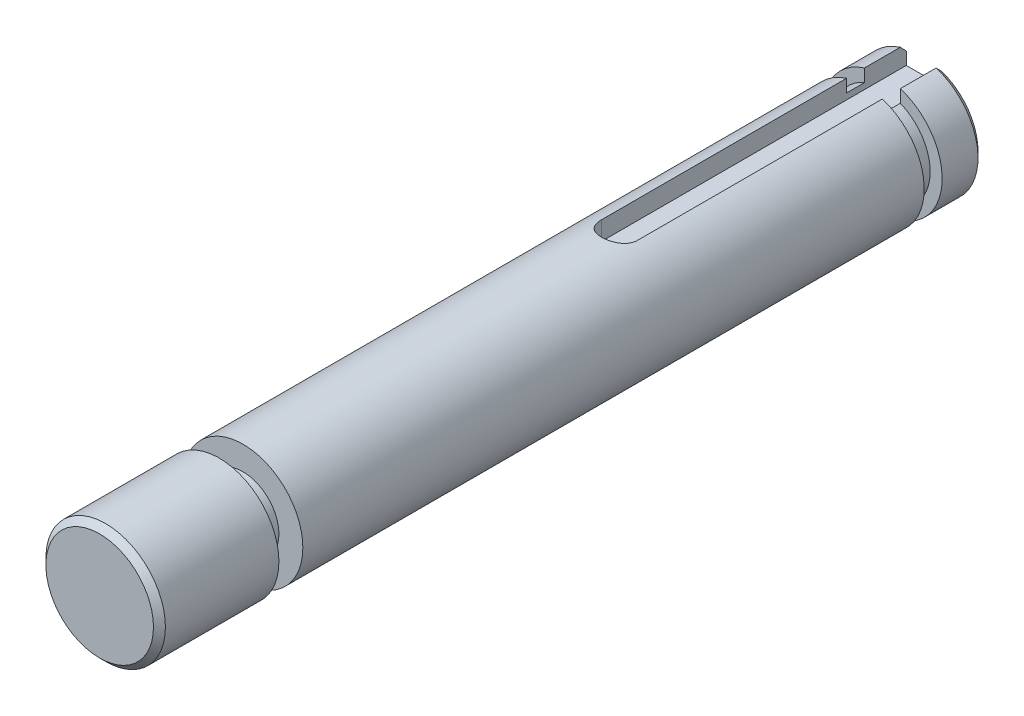
ISO-10303-21;
HEADER;
FILE_DESCRIPTION(('STEP AP214'),'2;1');
FILE_NAME('part.step','',(''),(''),'','','');
FILE_SCHEMA(('AUTOMOTIVE_DESIGN { 1 0 10303 214 1 1 1 1 }'));
ENDSEC;
DATA;
#1=APPLICATION_CONTEXT('core data for automotive mechanical design processes');
#2=APPLICATION_PROTOCOL_DEFINITION('international standard','automotive_design',2000,#1);
#3=PRODUCT_CONTEXT('',#1,'mechanical');
#4=PRODUCT('Part','Part','',(#3));
#5=PRODUCT_RELATED_PRODUCT_CATEGORY('part','',(#4));
#6=PRODUCT_DEFINITION_FORMATION('','',#4);
#7=PRODUCT_DEFINITION_CONTEXT('part definition',#1,'design');
#8=PRODUCT_DEFINITION('design','',#6,#7);
#9=PRODUCT_DEFINITION_SHAPE('','',#8);
#10=(LENGTH_UNIT() NAMED_UNIT(*) SI_UNIT(.MILLI.,.METRE.));
#11=(NAMED_UNIT(*) PLANE_ANGLE_UNIT() SI_UNIT($,.RADIAN.));
#12=(NAMED_UNIT(*) SI_UNIT($,.STERADIAN.) SOLID_ANGLE_UNIT());
#13=UNCERTAINTY_MEASURE_WITH_UNIT(LENGTH_MEASURE(1.E-05),#10,'distance_accuracy_value','');
#14=(GEOMETRIC_REPRESENTATION_CONTEXT(3) GLOBAL_UNCERTAINTY_ASSIGNED_CONTEXT((#13)) GLOBAL_UNIT_ASSIGNED_CONTEXT((#10,
#11,#12)) REPRESENTATION_CONTEXT('',''));
#15=CARTESIAN_POINT('',(0.,0.,0.));
#16=DIRECTION('',(0.,0.,1.));
#17=DIRECTION('',(1.,0.,0.));
#18=AXIS2_PLACEMENT_3D('',#15,#16,#17);
#19=CARTESIAN_POINT('',(0.,0.,34.5));
#20=DIRECTION('',(0.,0.,-1.));
#21=DIRECTION('',(-1.,0.,0.));
#22=AXIS2_PLACEMENT_3D('',#19,#20,#21);
#23=CYLINDRICAL_SURFACE('',#22,5.);
#24=CARTESIAN_POINT('',(0.,0.,22.5));
#25=DIRECTION('',(0.,0.,1.));
#26=DIRECTION('',(1.,0.,0.));
#27=AXIS2_PLACEMENT_3D('',#24,#25,#26);
#28=CIRCLE('',#27,5.);
#29=CARTESIAN_POINT('',(5.,0.,22.5));
#30=VERTEX_POINT('',#29);
#31=EDGE_CURVE('E180',#30,#30,#28,.T.);
#32=ORIENTED_EDGE('',*,*,#31,.F.);
#33=EDGE_LOOP('',(#32));
#34=FACE_BOUND('',#33,.T.);
#35=DIRECTION('',(0.,0.,-1.));
#36=VECTOR('',#35,1.);
#37=CARTESIAN_POINT('',(-1.49999999999999,4.76969600708473,34.5));
#38=LINE('',#37,#36);
#39=CARTESIAN_POINT('',(-1.5,4.76969600708473,-29.5));
#40=VERTEX_POINT('',#39);
#41=CARTESIAN_POINT('',(-1.5,4.76969600708473,-9.00000000000001));
#42=VERTEX_POINT('',#41);
#43=EDGE_CURVE('E159',#40,#42,#38,.F.);
#44=ORIENTED_EDGE('',*,*,#43,.F.);
#45=CARTESIAN_POINT('',(0.,0.,-29.5));
#46=DIRECTION('',(0.,0.,-1.));
#47=DIRECTION('',(-1.,0.,0.));
#48=AXIS2_PLACEMENT_3D('',#45,#46,#47);
#49=CIRCLE('',#48,5.);
#50=CARTESIAN_POINT('',(1.5,4.76969600708473,-29.5));
#51=VERTEX_POINT('',#50);
#52=EDGE_CURVE('E165',#51,#40,#49,.T.);
#53=ORIENTED_EDGE('',*,*,#52,.F.);
#54=DIRECTION('',(0.,0.,-1.));
#55=VECTOR('',#54,1.);
#56=CARTESIAN_POINT('',(1.50000000000001,4.76969600708473,34.5));
#57=LINE('',#56,#55);
#58=CARTESIAN_POINT('',(1.5,4.76969600708473,-9.00000000000001));
#59=VERTEX_POINT('',#58);
#60=EDGE_CURVE('E150',#59,#51,#57,.T.);
#61=ORIENTED_EDGE('',*,*,#60,.F.);
#62=CARTESIAN_POINT('',(-1.5,4.76969600708473,-9.00000000000001));
#63=CARTESIAN_POINT('',(-1.50000085357071,4.76969249084934,-8.95882060709199));
#64=CARTESIAN_POINT('',(-1.49830317083428,4.77022997000129,-8.91766195687388));
#65=CARTESIAN_POINT('',(-1.49153785660317,4.77235095109999,-8.83565883790444));
#66=CARTESIAN_POINT('',(-1.48647098275841,4.77393421787376,-8.79481430060511));
#67=CARTESIAN_POINT('',(-1.46630203689311,4.78018490618873,-8.67340945904534));
#68=CARTESIAN_POINT('',(-1.44623120413663,4.78635370384275,-8.59369360958363));
#69=CARTESIAN_POINT('',(-1.39353102315626,4.80195952113208,-8.43896442161414));
#70=CARTESIAN_POINT('',(-1.36090607068203,4.81139539670393,-8.36394944780192));
#71=CARTESIAN_POINT('',(-1.28407841117656,4.83246571212052,-8.22040331840241));
#72=CARTESIAN_POINT('',(-1.23987031651226,4.84410117434933,-8.15187520027157));
#73=CARTESIAN_POINT('',(-1.13964850658326,4.86866835244721,-8.02113394400295));
#74=CARTESIAN_POINT('',(-1.08333433465209,4.88162755412974,-7.95915633965661));
#75=CARTESIAN_POINT('',(-0.961138919873358,4.90714811559049,-7.84536441610004));
#76=CARTESIAN_POINT('',(-0.895256063916352,4.91970940785249,-7.79355181399695));
#77=CARTESIAN_POINT('',(-0.754109921315434,4.94333239727705,-7.70053622968151));
#78=CARTESIAN_POINT('',(-0.678680819336264,4.95435770971354,-7.65957481970205));
#79=CARTESIAN_POINT('',(-0.521621185505779,4.97334469846208,-7.59101158838185));
#80=CARTESIAN_POINT('',(-0.439992259012932,4.98130716463903,-7.56340632220573));
#81=CARTESIAN_POINT('',(-0.275324697874883,4.99307639935002,-7.52312020089796));
#82=CARTESIAN_POINT('',(-0.192393125294258,4.99699549276993,-7.51003514203026));
#83=CARTESIAN_POINT('',(-0.0254235719980863,5.00063202022426,-7.49788265863674));
#84=CARTESIAN_POINT('',(0.0586141962423579,5.00035024971471,-7.49881258029984));
#85=CARTESIAN_POINT('',(0.222571599946012,4.99569602566267,-7.514392908759));
#86=CARTESIAN_POINT('',(0.302537145464637,4.99145415509187,-7.52860534497872));
#87=CARTESIAN_POINT('',(0.458890052102021,4.9795151369998,-7.56963163523811));
#88=CARTESIAN_POINT('',(0.535277225531993,4.97181780846028,-7.59644614945594));
#89=CARTESIAN_POINT('',(0.683347815892212,4.95365214926145,-7.66221222164644));
#90=CARTESIAN_POINT('',(0.754966006044137,4.94315255692525,-7.70130164435695));
#91=CARTESIAN_POINT('',(0.890765529574415,4.92049624651755,-7.79039859004832));
#92=CARTESIAN_POINT('',(0.95494519161459,4.90833915735884,-7.84040855947884));
#93=CARTESIAN_POINT('',(1.07665450541274,4.88311673571409,-7.95219198808351));
#94=CARTESIAN_POINT('',(1.13383351478033,4.87003445449554,-8.01434386376075));
#95=CARTESIAN_POINT('',(1.23706769492487,4.84484215114658,-8.14749742342792));
#96=CARTESIAN_POINT('',(1.28311962013077,4.83273241337566,-8.21850168036553));
#97=CARTESIAN_POINT('',(1.36316407240863,4.81077228795653,-8.36828092844929));
#98=CARTESIAN_POINT('',(1.39703006341134,4.80094596245948,-8.44712717959341));
#99=CARTESIAN_POINT('',(1.45085886004699,4.78495663653201,-8.60972450398175));
#100=CARTESIAN_POINT('',(1.47084293218035,4.77878803475875,-8.69346786071438));
#101=CARTESIAN_POINT('',(1.48901203590079,4.77314032325006,-8.81499488907019));
#102=CARTESIAN_POINT('',(1.49313202989008,4.77185156275267,-8.85189073417961));
#103=CARTESIAN_POINT('',(1.49862355614854,4.77012928611782,-8.92585147909953));
#104=CARTESIAN_POINT('',(1.49999912968268,4.76969451246644,-8.96291604966386));
#105=CARTESIAN_POINT('',(1.5,4.76969600708473,-9.00000000000001));
#106=B_SPLINE_CURVE_WITH_KNOTS('',3,(#62,#63,#64,#65,#66,#67,#68,#69,#70,#71,#72,#73,#74,#75,
#76,#77,#78,#79,#80,#81,#82,#83,#84,#85,#86,#87,#88,#89,#90,#91,#92,#93,#94,#95,#96,#97,#98,#99,
#100,#101,#102,#103,#104,#105),.UNSPECIFIED.,.F.,.F.,(4,2,2,2,2,2,2,2,2,2,2,2,2,2,2,2,2,2,2,2,2,
4),(0.,0.123459071219734,0.246890388853042,0.49291134961521,0.738846245884325,0.984895736828092,
1.23795510798803,1.49105719006936,1.74939356197455,2.00766326783256,2.25854751319802,
2.5093842528947,2.75223130012966,2.99509107067835,3.2407824256273,3.48652887757004,
3.74172568310981,3.99699683536777,4.25484698071527,4.51230123440207,4.62365084745809,
4.73483637253615),.UNSPECIFIED.);
#107=EDGE_CURVE('E11',#42,#59,#106,.T.);
#108=ORIENTED_EDGE('',*,*,#107,.F.);
#109=EDGE_LOOP('',(#44,#53,#61,#108));
#110=FACE_BOUND('',#109,.T.);
#111=ADVANCED_FACE('F36',(#34,#110),#23,.T.);
#112=CARTESIAN_POINT('',(0.,0.,-31.));
#113=DIRECTION('',(0.,0.,-1.));
#114=DIRECTION('',(-1.,0.,0.));
#115=AXIS2_PLACEMENT_3D('',#112,#113,#114);
#116=PLANE('',#115);
#117=DIRECTION('',(0.,-1.,0.));
#118=VECTOR('',#117,1.);
#119=CARTESIAN_POINT('',(-1.5,0.,-31.));
#120=LINE('',#119,#118);
#121=CARTESIAN_POINT('',(-1.49999999999999,4.76969600708473,-31.));
#122=VERTEX_POINT('',#121);
#123=CARTESIAN_POINT('',(-1.5,3.70809924354783,-31.));
#124=VERTEX_POINT('',#123);
#125=EDGE_CURVE('E154',#122,#124,#120,.T.);
#126=ORIENTED_EDGE('',*,*,#125,.F.);
#127=CARTESIAN_POINT('',(0.,0.,-31.));
#128=DIRECTION('',(0.,0.,-1.));
#129=DIRECTION('',(-1.,0.,0.));
#130=AXIS2_PLACEMENT_3D('',#127,#128,#129);
#131=CIRCLE('',#130,5.);
#132=CARTESIAN_POINT('',(1.50000000000001,4.76969600708473,-31.));
#133=VERTEX_POINT('',#132);
#134=EDGE_CURVE('E168',#133,#122,#131,.T.);
#135=ORIENTED_EDGE('',*,*,#134,.F.);
#136=DIRECTION('',(0.,1.,0.));
#137=VECTOR('',#136,1.);
#138=CARTESIAN_POINT('',(1.5,0.,-31.));
#139=LINE('',#138,#137);
#140=CARTESIAN_POINT('',(1.5,3.70809924354783,-31.));
#141=VERTEX_POINT('',#140);
#142=EDGE_CURVE('E138',#141,#133,#139,.T.);
#143=ORIENTED_EDGE('',*,*,#142,.F.);
#144=CARTESIAN_POINT('',(0.,0.,-31.));
#145=DIRECTION('',(0.,0.,-1.));
#146=DIRECTION('',(-1.,0.,0.));
#147=AXIS2_PLACEMENT_3D('',#144,#145,#146);
#148=CIRCLE('',#147,4.);
#149=EDGE_CURVE('E162',#141,#124,#148,.T.);
#150=ORIENTED_EDGE('',*,*,#149,.T.);
#151=EDGE_LOOP('',(#126,#135,#143,#150));
#152=FACE_BOUND('',#151,.T.);
#153=ADVANCED_FACE('F224',(#152),#116,.F.);
#154=CARTESIAN_POINT('',(0.,0.,-29.5));
#155=DIRECTION('',(0.,0.,-1.));
#156=DIRECTION('',(-1.,0.,0.));
#157=AXIS2_PLACEMENT_3D('',#154,#155,#156);
#158=PLANE('',#157);
#159=ORIENTED_EDGE('',*,*,#52,.T.);
#160=DIRECTION('',(0.,-1.,0.));
#161=VECTOR('',#160,1.);
#162=CARTESIAN_POINT('',(-1.5,0.,-29.5));
#163=LINE('',#162,#161);
#164=CARTESIAN_POINT('',(-1.5,3.70809924354783,-29.5));
#165=VERTEX_POINT('',#164);
#166=EDGE_CURVE('E65',#40,#165,#163,.T.);
#167=ORIENTED_EDGE('',*,*,#166,.T.);
#168=CARTESIAN_POINT('',(0.,0.,-29.5));
#169=DIRECTION('',(0.,0.,-1.));
#170=DIRECTION('',(-1.,0.,0.));
#171=AXIS2_PLACEMENT_3D('',#168,#169,#170);
#172=CIRCLE('',#171,4.);
#173=CARTESIAN_POINT('',(1.5,3.70809924354783,-29.5));
#174=VERTEX_POINT('',#173);
#175=EDGE_CURVE('E161',#174,#165,#172,.T.);
#176=ORIENTED_EDGE('',*,*,#175,.F.);
#177=DIRECTION('',(0.,1.,0.));
#178=VECTOR('',#177,1.);
#179=CARTESIAN_POINT('',(1.5,0.,-29.5));
#180=LINE('',#179,#178);
#181=EDGE_CURVE('E147',#174,#51,#180,.T.);
#182=ORIENTED_EDGE('',*,*,#181,.T.);
#183=EDGE_LOOP('',(#159,#167,#176,#182));
#184=FACE_BOUND('',#183,.T.);
#185=ADVANCED_FACE('F222',(#184),#158,.T.);
#186=CARTESIAN_POINT('',(0.,0.,-31.));
#187=DIRECTION('',(0.,0.,1.));
#188=DIRECTION('',(1.,0.,0.));
#189=AXIS2_PLACEMENT_3D('',#186,#187,#188);
#190=CYLINDRICAL_SURFACE('',#189,4.);
#191=DIRECTION('',(0.,0.,1.));
#192=VECTOR('',#191,1.);
#193=CARTESIAN_POINT('',(-1.5,3.70809924354783,-31.));
#194=LINE('',#193,#192);
#195=EDGE_CURVE('E156',#124,#165,#194,.T.);
#196=ORIENTED_EDGE('',*,*,#195,.F.);
#197=ORIENTED_EDGE('',*,*,#149,.F.);
#198=DIRECTION('',(0.,0.,1.));
#199=VECTOR('',#198,1.);
#200=CARTESIAN_POINT('',(1.5,3.70809924354783,-31.));
#201=LINE('',#200,#199);
#202=EDGE_CURVE('E145',#174,#141,#201,.F.);
#203=ORIENTED_EDGE('',*,*,#202,.F.);
#204=ORIENTED_EDGE('',*,*,#175,.T.);
#205=EDGE_LOOP('',(#196,#197,#203,#204));
#206=FACE_BOUND('',#205,.T.);
#207=ADVANCED_FACE('F219',(#206),#190,.T.);
#208=CARTESIAN_POINT('',(0.,0.,-34.5));
#209=DIRECTION('',(0.,0.,1.));
#210=DIRECTION('',(1.,0.,0.));
#211=AXIS2_PLACEMENT_3D('',#208,#209,#210);
#212=PLANE('',#211);
#213=DIRECTION('',(0.,-1.,0.));
#214=VECTOR('',#213,1.);
#215=CARTESIAN_POINT('',(-1.5,5.,-34.5));
#216=LINE('',#215,#214);
#217=CARTESIAN_POINT('',(-1.5,4.24264068711929,-34.5));
#218=VERTEX_POINT('',#217);
#219=CARTESIAN_POINT('',(-1.5,3.2,-34.5));
#220=VERTEX_POINT('',#219);
#221=EDGE_CURVE('E115',#218,#220,#216,.T.);
#222=ORIENTED_EDGE('',*,*,#221,.T.);
#223=DIRECTION('',(-1.,0.,0.));
#224=VECTOR('',#223,1.);
#225=CARTESIAN_POINT('',(-1.5,3.2,-34.5));
#226=LINE('',#225,#224);
#227=CARTESIAN_POINT('',(1.5,3.2,-34.5));
#228=VERTEX_POINT('',#227);
#229=EDGE_CURVE('E123',#228,#220,#226,.T.);
#230=ORIENTED_EDGE('',*,*,#229,.F.);
#231=DIRECTION('',(0.,-1.,0.));
#232=VECTOR('',#231,1.);
#233=CARTESIAN_POINT('',(1.5,5.,-34.5));
#234=LINE('',#233,#232);
#235=CARTESIAN_POINT('',(1.5,4.24264068711929,-34.5));
#236=VERTEX_POINT('',#235);
#237=EDGE_CURVE('E270',#236,#228,#234,.T.);
#238=ORIENTED_EDGE('',*,*,#237,.F.);
#239=CARTESIAN_POINT('',(0.,0.,-34.5));
#240=DIRECTION('',(0.,0.,1.));
#241=DIRECTION('',(1.,0.,0.));
#242=AXIS2_PLACEMENT_3D('',#239,#240,#241);
#243=CIRCLE('',#242,4.5);
#244=EDGE_CURVE('E136',#236,#218,#243,.F.);
#245=ORIENTED_EDGE('',*,*,#244,.T.);
#246=EDGE_LOOP('',(#222,#230,#238,#245));
#247=FACE_BOUND('',#246,.T.);
#248=ADVANCED_FACE('F134',(#247),#212,.F.);
#249=DIRECTION('',(0.,0.,-1.));
#250=VECTOR('',#249,1.);
#251=CARTESIAN_POINT('',(-1.49999999999999,4.76969600708473,34.5));
#252=LINE('',#251,#250);
#253=CARTESIAN_POINT('',(-1.5,4.76969600708473,-34.));
#254=VERTEX_POINT('',#253);
#255=EDGE_CURVE('E152',#254,#122,#252,.F.);
#256=ORIENTED_EDGE('',*,*,#255,.F.);
#257=CARTESIAN_POINT('',(0.,0.,-34.));
#258=DIRECTION('',(0.,0.,1.));
#259=DIRECTION('',(1.,0.,0.));
#260=AXIS2_PLACEMENT_3D('',#257,#258,#259);
#261=CIRCLE('',#260,5.);
#262=CARTESIAN_POINT('',(1.5,4.76969600708473,-34.));
#263=VERTEX_POINT('',#262);
#264=EDGE_CURVE('E183',#254,#263,#261,.T.);
#265=ORIENTED_EDGE('',*,*,#264,.T.);
#266=DIRECTION('',(0.,0.,-1.));
#267=VECTOR('',#266,1.);
#268=CARTESIAN_POINT('',(1.50000000000001,4.76969600708473,34.5));
#269=LINE('',#268,#267);
#270=EDGE_CURVE('E57',#133,#263,#269,.T.);
#271=ORIENTED_EDGE('',*,*,#270,.F.);
#272=ORIENTED_EDGE('',*,*,#134,.T.);
#273=EDGE_LOOP('',(#256,#265,#271,#272));
#274=FACE_BOUND('',#273,.T.);
#275=ADVANCED_FACE('F249',(#274),#23,.T.);
#276=CARTESIAN_POINT('',(0.,0.,-34.));
#277=DIRECTION('',(0.,0.,1.));
#278=DIRECTION('',(1.,0.,0.));
#279=AXIS2_PLACEMENT_3D('',#276,#277,#278);
#280=CONICAL_SURFACE('',#279,5.,0.785398163397444);
#281=ORIENTED_EDGE('',*,*,#264,.F.);
#282=CARTESIAN_POINT('',(-1.5,6.9796900510726,-31.8609473171126));
#283=CARTESIAN_POINT('',(-1.5,6.76685846964304,-32.0690052900893));
#284=CARTESIAN_POINT('',(-1.5,6.55383788587081,-32.2768708615187));
#285=CARTESIAN_POINT('',(-1.5,6.12725063306096,-32.6920123009123));
#286=CARTESIAN_POINT('',(-1.5,5.91368400129659,-32.8992882071887));
#287=CARTESIAN_POINT('',(-1.5,5.48591440945266,-33.3129705368911));
#288=CARTESIAN_POINT('',(-1.5,5.27171181751179,-33.519377340571));
#289=CARTESIAN_POINT('',(-1.5,4.84224439352639,-33.9311150771752));
#290=CARTESIAN_POINT('',(-1.5,4.62697948499159,-34.1364459303664));
#291=CARTESIAN_POINT('',(-1.5,4.19476087473619,-34.5456625222699));
#292=CARTESIAN_POINT('',(-1.5,3.97780600015098,-34.7495470263421));
#293=CARTESIAN_POINT('',(-1.5,3.65061096884928,-35.0534378048551));
#294=CARTESIAN_POINT('',(-1.5,3.54126204128288,-35.1544031148046));
#295=CARTESIAN_POINT('',(-1.5,3.32179359398857,-35.3555012481673));
#296=CARTESIAN_POINT('',(-1.5,3.21167404938084,-35.4556340444719));
#297=CARTESIAN_POINT('',(-1.5,2.99036108474283,-35.6548638106812));
#298=CARTESIAN_POINT('',(-1.5,2.87916696721391,-35.7539600067692));
#299=CARTESIAN_POINT('',(-1.5,2.65545925655892,-35.9506379072296));
#300=CARTESIAN_POINT('',(-1.5,2.54294578342073,-36.0482197474772));
#301=CARTESIAN_POINT('',(-1.5,2.37277183064055,-36.1930149701006));
#302=CARTESIAN_POINT('',(-1.5,2.31579520626769,-36.2410318728437));
#303=CARTESIAN_POINT('',(-1.5,2.20129812592814,-36.3364104122461));
#304=CARTESIAN_POINT('',(-1.5,2.14377768514223,-36.3837720671063));
#305=CARTESIAN_POINT('',(-1.5,2.02807141801448,-36.4777140489333));
#306=CARTESIAN_POINT('',(-1.5,1.96988539566468,-36.5242941352244));
#307=CARTESIAN_POINT('',(-1.5,1.85271977151893,-36.6164558953132));
#308=CARTESIAN_POINT('',(-1.5,1.79374009379223,-36.6620374724692));
#309=CARTESIAN_POINT('',(-1.5,1.73429652557171,-36.7070140779739));
#310=B_SPLINE_CURVE_WITH_KNOTS('',3,(#282,#283,#284,#285,#286,#287,#288,#289,#290,#291,#292,
#293,#294,#295,#296,#297,#298,#299,#300,#301,#302,#303,#304,#305,#306,#307,#308,#309),
.UNSPECIFIED.,.F.,.F.,(4,2,2,2,2,2,2,2,2,2,2,2,2,4),(0.,0.892899837982887,1.78574027241742,
2.67813788006185,3.5706007090967,4.46375081632203,4.9102459232306,5.35675551262278,
5.80357753465276,6.25035923115377,6.47388976350276,6.69741407425854,6.92100599838937,
7.1446194683247),.UNSPECIFIED.);
#311=EDGE_CURVE('E50',#254,#218,#310,.T.);
#312=ORIENTED_EDGE('',*,*,#311,.T.);
#313=ORIENTED_EDGE('',*,*,#244,.F.);
#314=CARTESIAN_POINT('',(1.5,1.7342965255717,-36.7070140779739));
#315=CARTESIAN_POINT('',(1.5,1.77908693888238,-36.6731320660261));
#316=CARTESIAN_POINT('',(1.5,1.82361036804485,-36.638900551902));
#317=CARTESIAN_POINT('',(1.5,1.91218682312018,-36.5698385854765));
#318=CARTESIAN_POINT('',(1.5,1.95623987372422,-36.5350081648661));
#319=CARTESIAN_POINT('',(1.5,2.08777808501951,-36.429777402497));
#320=CARTESIAN_POINT('',(1.5,2.17466038152808,-36.3586237662692));
#321=CARTESIAN_POINT('',(1.5,2.34715722091077,-36.2148824831829));
#322=CARTESIAN_POINT('',(1.5,2.43277232638575,-36.142295508272));
#323=CARTESIAN_POINT('',(1.5,2.60305076304627,-35.9960055754008));
#324=CARTESIAN_POINT('',(1.5,2.68771403759742,-35.922302551641));
#325=CARTESIAN_POINT('',(1.5,2.94046166043099,-35.7000248776767));
#326=CARTESIAN_POINT('',(1.5,3.1074261222846,-35.5501783529504));
#327=CARTESIAN_POINT('',(1.5,3.43942871545459,-35.2483420576352));
#328=CARTESIAN_POINT('',(1.5,3.60446663688283,-35.0963520574344));
#329=CARTESIAN_POINT('',(1.5,3.82259025149472,-34.8936868957398));
#330=CARTESIAN_POINT('',(1.5,3.87627856474983,-34.8436588755591));
#331=CARTESIAN_POINT('',(1.5,3.98352350180324,-34.7434647717696));
#332=CARTESIAN_POINT('',(1.5,4.03708012916458,-34.6932986919759));
#333=CARTESIAN_POINT('',(1.5,4.19758760920788,-34.542603266947));
#334=CARTESIAN_POINT('',(1.5,4.30436392171742,-34.4418880268484));
#335=CARTESIAN_POINT('',(1.5,4.62707098042186,-34.1363681367456));
#336=CARTESIAN_POINT('',(1.5,4.84242035233032,-33.9309496354163));
#337=CARTESIAN_POINT('',(1.5,5.27207641108813,-33.5190245458366));
#338=CARTESIAN_POINT('',(1.5,5.4863830917575,-33.3125179511522));
#339=CARTESIAN_POINT('',(1.5,5.91416941738404,-32.898818107301));
#340=CARTESIAN_POINT('',(1.5,6.12764935393665,-32.6916251594587));
#341=CARTESIAN_POINT('',(1.5,6.55404567632189,-32.2766677830417));
#342=CARTESIAN_POINT('',(1.5,6.76696207235694,-32.0689033649537));
#343=CARTESIAN_POINT('',(1.5,6.9796900510726,-31.8609473171126));
#344=B_SPLINE_CURVE_WITH_KNOTS('',3,(#314,#315,#316,#317,#318,#319,#320,#321,#322,#323,#324,
#325,#326,#327,#328,#329,#330,#331,#332,#333,#334,#335,#336,#337,#338,#339,#340,#341,#342,#343),
.UNSPECIFIED.,.F.,.F.,(4,2,2,2,2,2,2,2,2,2,2,2,2,2,4),(0.,0.168481178560409,0.336953469263775,
0.673829854894287,1.01055189600277,1.34729386731287,2.02029767349439,2.69337412875387,
2.91352652434994,3.1336728962291,3.57401537215846,4.46684087004097,5.35967165323346,
6.25215200141002,7.1446160799062),.UNSPECIFIED.);
#345=EDGE_CURVE('E195',#236,#263,#344,.T.);
#346=ORIENTED_EDGE('',*,*,#345,.T.);
#347=EDGE_LOOP('',(#281,#312,#313,#346));
#348=FACE_BOUND('',#347,.T.);
#349=ADVANCED_FACE('F206',(#348),#280,.T.);
#350=CARTESIAN_POINT('',(0.,0.,22.5));
#351=DIRECTION('',(0.,0.,1.));
#352=DIRECTION('',(1.,0.,0.));
#353=AXIS2_PLACEMENT_3D('',#350,#351,#352);
#354=PLANE('',#353);
#355=CARTESIAN_POINT('',(0.,0.,22.5));
#356=DIRECTION('',(0.,0.,1.));
#357=DIRECTION('',(1.,0.,0.));
#358=AXIS2_PLACEMENT_3D('',#355,#356,#357);
#359=CIRCLE('',#358,3.);
#360=CARTESIAN_POINT('',(3.,0.,22.5));
#361=VERTEX_POINT('',#360);
#362=EDGE_CURVE('E174',#361,#361,#359,.T.);
#363=ORIENTED_EDGE('',*,*,#362,.F.);
#364=EDGE_LOOP('',(#363));
#365=FACE_BOUND('',#364,.T.);
#366=ORIENTED_EDGE('',*,*,#31,.T.);
#367=EDGE_LOOP('',(#366));
#368=FACE_BOUND('',#367,.T.);
#369=ADVANCED_FACE('F237',(#365,#368),#354,.T.);
#370=CARTESIAN_POINT('',(0.,0.,24.5));
#371=DIRECTION('',(0.,0.,1.));
#372=DIRECTION('',(1.,0.,0.));
#373=AXIS2_PLACEMENT_3D('',#370,#371,#372);
#374=PLANE('',#373);
#375=CARTESIAN_POINT('',(0.,0.,24.5));
#376=DIRECTION('',(0.,0.,1.));
#377=DIRECTION('',(1.,0.,0.));
#378=AXIS2_PLACEMENT_3D('',#375,#376,#377);
#379=CIRCLE('',#378,3.);
#380=CARTESIAN_POINT('',(3.,0.,24.5));
#381=VERTEX_POINT('',#380);
#382=EDGE_CURVE('E171',#381,#381,#379,.T.);
#383=ORIENTED_EDGE('',*,*,#382,.T.);
#384=EDGE_LOOP('',(#383));
#385=FACE_BOUND('',#384,.T.);
#386=CARTESIAN_POINT('',(0.,0.,24.5));
#387=DIRECTION('',(0.,0.,1.));
#388=DIRECTION('',(1.,0.,0.));
#389=AXIS2_PLACEMENT_3D('',#386,#387,#388);
#390=CIRCLE('',#389,5.);
#391=CARTESIAN_POINT('',(5.,0.,24.5));
#392=VERTEX_POINT('',#391);
#393=EDGE_CURVE('E177',#392,#392,#390,.T.);
#394=ORIENTED_EDGE('',*,*,#393,.F.);
#395=EDGE_LOOP('',(#394));
#396=FACE_BOUND('',#395,.T.);
#397=ADVANCED_FACE('F235',(#385,#396),#374,.F.);
#398=CARTESIAN_POINT('',(0.,0.,22.5));
#399=DIRECTION('',(0.,0.,1.));
#400=DIRECTION('',(1.,0.,0.));
#401=AXIS2_PLACEMENT_3D('',#398,#399,#400);
#402=CYLINDRICAL_SURFACE('',#401,3.);
#403=ORIENTED_EDGE('',*,*,#362,.T.);
#404=EDGE_LOOP('',(#403));
#405=FACE_BOUND('',#404,.T.);
#406=ORIENTED_EDGE('',*,*,#382,.F.);
#407=EDGE_LOOP('',(#406));
#408=FACE_BOUND('',#407,.T.);
#409=ADVANCED_FACE('F231',(#405,#408),#402,.T.);
#410=CARTESIAN_POINT('',(0.,0.,34.5));
#411=DIRECTION('',(0.,0.,1.));
#412=DIRECTION('',(1.,0.,0.));
#413=AXIS2_PLACEMENT_3D('',#410,#411,#412);
#414=PLANE('',#413);
#415=CARTESIAN_POINT('',(0.,0.,34.5));
#416=DIRECTION('',(0.,0.,1.));
#417=DIRECTION('',(1.,0.,0.));
#418=AXIS2_PLACEMENT_3D('',#415,#416,#417);
#419=CIRCLE('',#418,4.5);
#420=CARTESIAN_POINT('',(4.5,0.,34.5));
#421=VERTEX_POINT('',#420);
#422=EDGE_CURVE('E189',#421,#421,#419,.T.);
#423=ORIENTED_EDGE('',*,*,#422,.T.);
#424=EDGE_LOOP('',(#423));
#425=FACE_BOUND('',#424,.T.);
#426=ADVANCED_FACE('F234',(#425),#414,.T.);
#427=CARTESIAN_POINT('',(0.,0.,34.));
#428=DIRECTION('',(0.,0.,1.));
#429=DIRECTION('',(1.,0.,0.));
#430=AXIS2_PLACEMENT_3D('',#427,#428,#429);
#431=CIRCLE('',#430,5.);
#432=CARTESIAN_POINT('',(5.,0.,34.));
#433=VERTEX_POINT('',#432);
#434=EDGE_CURVE('E192',#433,#433,#431,.F.);
#435=ORIENTED_EDGE('',*,*,#434,.T.);
#436=EDGE_LOOP('',(#435));
#437=FACE_BOUND('',#436,.T.);
#438=ORIENTED_EDGE('',*,*,#393,.T.);
#439=EDGE_LOOP('',(#438));
#440=FACE_BOUND('',#439,.T.);
#441=ADVANCED_FACE('F246',(#437,#440),#23,.T.);
#442=CARTESIAN_POINT('',(0.,0.,34.5));
#443=DIRECTION('',(0.,0.,-1.));
#444=DIRECTION('',(-1.,0.,0.));
#445=AXIS2_PLACEMENT_3D('',#442,#443,#444);
#446=CONICAL_SURFACE('',#445,4.5,0.785398163397451);
#447=ORIENTED_EDGE('',*,*,#434,.F.);
#448=EDGE_LOOP('',(#447));
#449=FACE_BOUND('',#448,.T.);
#450=ORIENTED_EDGE('',*,*,#422,.F.);
#451=EDGE_LOOP('',(#450));
#452=FACE_BOUND('',#451,.T.);
#453=ADVANCED_FACE('F38',(#449,#452),#446,.T.);
#454=CARTESIAN_POINT('',(0.,5.,-9.00000000000001));
#455=DIRECTION('',(0.,-1.,0.));
#456=DIRECTION('',(0.,0.,-1.));
#457=AXIS2_PLACEMENT_3D('',#454,#455,#456);
#458=CYLINDRICAL_SURFACE('',#457,1.5);
#459=DIRECTION('',(0.,-1.,0.));
#460=VECTOR('',#459,1.);
#461=CARTESIAN_POINT('',(-1.5,5.,-9.00000000000001));
#462=LINE('',#461,#460);
#463=CARTESIAN_POINT('',(-1.5,3.2,-9.00000000000001));
#464=VERTEX_POINT('',#463);
#465=EDGE_CURVE('E118',#42,#464,#462,.T.);
#466=ORIENTED_EDGE('',*,*,#465,.F.);
#467=ORIENTED_EDGE('',*,*,#107,.T.);
#468=DIRECTION('',(0.,-1.,0.));
#469=VECTOR('',#468,1.);
#470=CARTESIAN_POINT('',(1.5,5.,-9.00000000000001));
#471=LINE('',#470,#469);
#472=CARTESIAN_POINT('',(1.5,3.2,-9.00000000000001));
#473=VERTEX_POINT('',#472);
#474=EDGE_CURVE('E140',#59,#473,#471,.T.);
#475=ORIENTED_EDGE('',*,*,#474,.T.);
#476=CARTESIAN_POINT('',(0.,3.2,-9.00000000000001));
#477=DIRECTION('',(0.,1.,0.));
#478=DIRECTION('',(0.,0.,1.));
#479=AXIS2_PLACEMENT_3D('',#476,#477,#478);
#480=CIRCLE('',#479,1.5);
#481=EDGE_CURVE('E122',#464,#473,#480,.T.);
#482=ORIENTED_EDGE('',*,*,#481,.F.);
#483=EDGE_LOOP('',(#466,#467,#475,#482));
#484=FACE_BOUND('',#483,.T.);
#485=ADVANCED_FACE('F212',(#484),#458,.F.);
#486=CARTESIAN_POINT('',(-1.5,5.,-34.5));
#487=DIRECTION('',(1.,0.,0.));
#488=DIRECTION('',(0.,0.,-1.));
#489=AXIS2_PLACEMENT_3D('',#486,#487,#488);
#490=PLANE('',#489);
#491=ORIENTED_EDGE('',*,*,#43,.T.);
#492=ORIENTED_EDGE('',*,*,#465,.T.);
#493=DIRECTION('',(0.,0.,1.));
#494=VECTOR('',#493,1.);
#495=CARTESIAN_POINT('',(-1.5,3.2,-34.5));
#496=LINE('',#495,#494);
#497=EDGE_CURVE('E111',#220,#464,#496,.T.);
#498=ORIENTED_EDGE('',*,*,#497,.F.);
#499=ORIENTED_EDGE('',*,*,#221,.F.);
#500=ORIENTED_EDGE('',*,*,#311,.F.);
#501=ORIENTED_EDGE('',*,*,#255,.T.);
#502=ORIENTED_EDGE('',*,*,#125,.T.);
#503=ORIENTED_EDGE('',*,*,#195,.T.);
#504=ORIENTED_EDGE('',*,*,#166,.F.);
#505=EDGE_LOOP('',(#491,#492,#498,#499,#500,#501,#502,#503,#504));
#506=FACE_BOUND('',#505,.T.);
#507=ADVANCED_FACE('F113',(#506),#490,.T.);
#508=CARTESIAN_POINT('',(1.5,5.,-34.5));
#509=DIRECTION('',(-1.,0.,0.));
#510=DIRECTION('',(0.,0.,1.));
#511=AXIS2_PLACEMENT_3D('',#508,#509,#510);
#512=PLANE('',#511);
#513=ORIENTED_EDGE('',*,*,#60,.T.);
#514=ORIENTED_EDGE('',*,*,#181,.F.);
#515=ORIENTED_EDGE('',*,*,#202,.T.);
#516=ORIENTED_EDGE('',*,*,#142,.T.);
#517=ORIENTED_EDGE('',*,*,#270,.T.);
#518=ORIENTED_EDGE('',*,*,#345,.F.);
#519=ORIENTED_EDGE('',*,*,#237,.T.);
#520=DIRECTION('',(0.,0.,-1.));
#521=VECTOR('',#520,1.);
#522=CARTESIAN_POINT('',(1.5,3.2,-34.5));
#523=LINE('',#522,#521);
#524=EDGE_CURVE('E129',#473,#228,#523,.T.);
#525=ORIENTED_EDGE('',*,*,#524,.F.);
#526=ORIENTED_EDGE('',*,*,#474,.F.);
#527=EDGE_LOOP('',(#513,#514,#515,#516,#517,#518,#519,#525,#526));
#528=FACE_BOUND('',#527,.T.);
#529=ADVANCED_FACE('F208',(#528),#512,.T.);
#530=CARTESIAN_POINT('',(0.,3.2,-9.00000000000001));
#531=DIRECTION('',(0.,1.,0.));
#532=DIRECTION('',(0.,0.,1.));
#533=AXIS2_PLACEMENT_3D('',#530,#531,#532);
#534=PLANE('',#533);
#535=ORIENTED_EDGE('',*,*,#229,.T.);
#536=ORIENTED_EDGE('',*,*,#497,.T.);
#537=ORIENTED_EDGE('',*,*,#481,.T.);
#538=ORIENTED_EDGE('',*,*,#524,.T.);
#539=EDGE_LOOP('',(#535,#536,#537,#538));
#540=FACE_BOUND('',#539,.T.);
#541=ADVANCED_FACE('F127',(#540),#534,.T.);
#542=CLOSED_SHELL('',(#111,#153,#185,#207,#248,#275,#349,#369,#397,#409,#426,#441,#453,#485,
#507,#529,#541));
#543=MANIFOLD_SOLID_BREP('B2',#542);
#544=ADVANCED_BREP_SHAPE_REPRESENTATION('',(#18,#543),#14);
#545=SHAPE_DEFINITION_REPRESENTATION(#9,#544);
ENDSEC;
END-ISO-10303-21;
